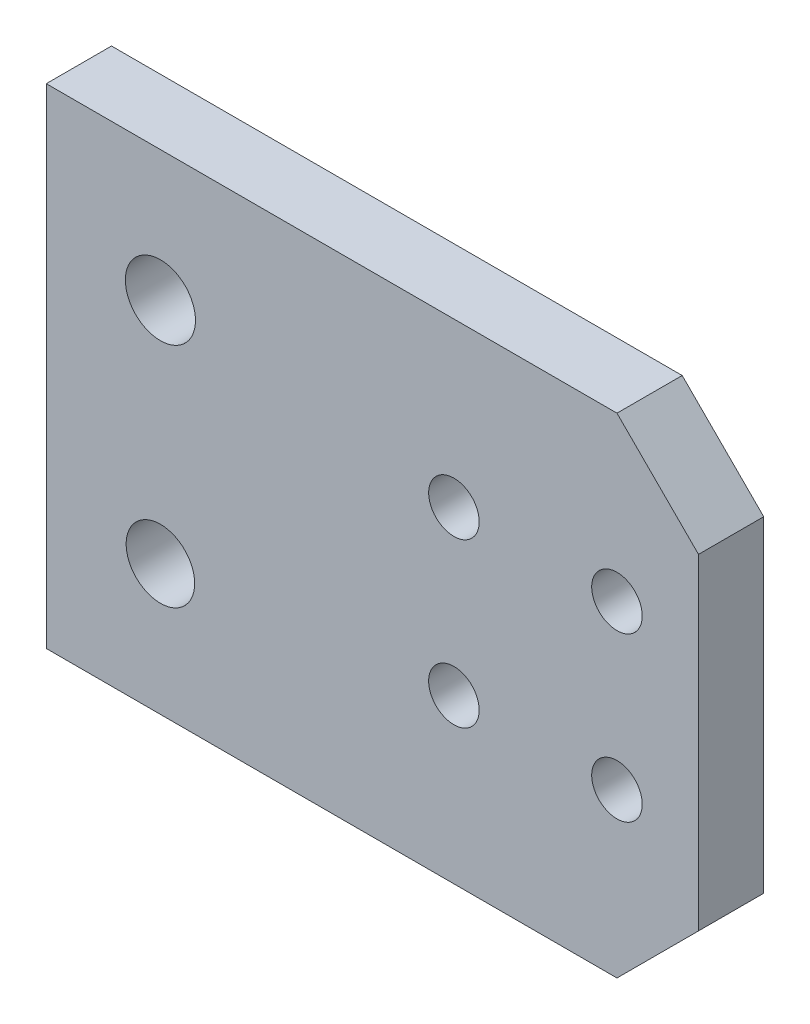
ISO-10303-21;
HEADER;
FILE_DESCRIPTION(('STEP AP214'),'2;1');
FILE_NAME('part.step','',(''),(''),'','','');
FILE_SCHEMA(('AUTOMOTIVE_DESIGN { 1 0 10303 214 1 1 1 1 }'));
ENDSEC;
DATA;
#1=APPLICATION_CONTEXT('core data for automotive mechanical design processes');
#2=APPLICATION_PROTOCOL_DEFINITION('international standard','automotive_design',2000,#1);
#3=PRODUCT_CONTEXT('',#1,'mechanical');
#4=PRODUCT('Part','Part','',(#3));
#5=PRODUCT_RELATED_PRODUCT_CATEGORY('part','',(#4));
#6=PRODUCT_DEFINITION_FORMATION('','',#4);
#7=PRODUCT_DEFINITION_CONTEXT('part definition',#1,'design');
#8=PRODUCT_DEFINITION('design','',#6,#7);
#9=PRODUCT_DEFINITION_SHAPE('','',#8);
#10=(LENGTH_UNIT() NAMED_UNIT(*) SI_UNIT(.MILLI.,.METRE.));
#11=(NAMED_UNIT(*) PLANE_ANGLE_UNIT() SI_UNIT($,.RADIAN.));
#12=(NAMED_UNIT(*) SI_UNIT($,.STERADIAN.) SOLID_ANGLE_UNIT());
#13=UNCERTAINTY_MEASURE_WITH_UNIT(LENGTH_MEASURE(1.E-05),#10,'distance_accuracy_value','');
#14=(GEOMETRIC_REPRESENTATION_CONTEXT(3) GLOBAL_UNCERTAINTY_ASSIGNED_CONTEXT((#13)) GLOBAL_UNIT_ASSIGNED_CONTEXT((#10,
#11,#12)) REPRESENTATION_CONTEXT('',''));
#15=CARTESIAN_POINT('',(0.,0.,0.));
#16=DIRECTION('',(0.,0.,1.));
#17=DIRECTION('',(1.,0.,0.));
#18=AXIS2_PLACEMENT_3D('',#15,#16,#17);
#19=CARTESIAN_POINT('',(0.,0.,4.));
#20=DIRECTION('',(0.,0.,-1.));
#21=DIRECTION('',(-1.,0.,0.));
#22=AXIS2_PLACEMENT_3D('',#19,#20,#21);
#23=PLANE('',#22);
#24=DIRECTION('',(1.,0.,0.));
#25=VECTOR('',#24,1.);
#26=CARTESIAN_POINT('',(0.,0.,4.));
#27=LINE('',#26,#25);
#28=CARTESIAN_POINT('',(0.,0.,4.));
#29=VERTEX_POINT('',#28);
#30=CARTESIAN_POINT('',(35.,0.,4.));
#31=VERTEX_POINT('',#30);
#32=EDGE_CURVE('E97',#29,#31,#27,.T.);
#33=ORIENTED_EDGE('',*,*,#32,.T.);
#34=DIRECTION('',(-0.707106781186549,-0.707106781186547,0.));
#35=VECTOR('',#34,1.);
#36=CARTESIAN_POINT('',(40.,5.,4.));
#37=LINE('',#36,#35);
#38=CARTESIAN_POINT('',(40.,5.,4.));
#39=VERTEX_POINT('',#38);
#40=EDGE_CURVE('E52',#31,#39,#37,.F.);
#41=ORIENTED_EDGE('',*,*,#40,.T.);
#42=DIRECTION('',(0.,1.,0.));
#43=VECTOR('',#42,1.);
#44=CARTESIAN_POINT('',(40.,0.,4.));
#45=LINE('',#44,#43);
#46=CARTESIAN_POINT('',(40.,25.,4.));
#47=VERTEX_POINT('',#46);
#48=EDGE_CURVE('E104',#39,#47,#45,.T.);
#49=ORIENTED_EDGE('',*,*,#48,.T.);
#50=DIRECTION('',(0.707106781186546,-0.70710678118655,0.));
#51=VECTOR('',#50,1.);
#52=CARTESIAN_POINT('',(35.,30.,4.));
#53=LINE('',#52,#51);
#54=CARTESIAN_POINT('',(35.,30.,4.));
#55=VERTEX_POINT('',#54);
#56=EDGE_CURVE('E59',#47,#55,#53,.F.);
#57=ORIENTED_EDGE('',*,*,#56,.T.);
#58=DIRECTION('',(-1.,0.,0.));
#59=VECTOR('',#58,1.);
#60=CARTESIAN_POINT('',(0.,30.,4.));
#61=LINE('',#60,#59);
#62=CARTESIAN_POINT('',(0.,30.,4.));
#63=VERTEX_POINT('',#62);
#64=EDGE_CURVE('E109',#55,#63,#61,.T.);
#65=ORIENTED_EDGE('',*,*,#64,.T.);
#66=DIRECTION('',(0.,-1.,0.));
#67=VECTOR('',#66,1.);
#68=CARTESIAN_POINT('',(0.,0.,4.));
#69=LINE('',#68,#67);
#70=EDGE_CURVE('E105',#63,#29,#69,.T.);
#71=ORIENTED_EDGE('',*,*,#70,.T.);
#72=EDGE_LOOP('',(#33,#41,#49,#57,#65,#71));
#73=FACE_BOUND('',#72,.T.);
#74=CARTESIAN_POINT('',(7.,22.,4.));
#75=DIRECTION('',(0.,0.,1.));
#76=DIRECTION('',(1.,0.,0.));
#77=AXIS2_PLACEMENT_3D('',#74,#75,#76);
#78=CIRCLE('',#77,2.14999999999999);
#79=CARTESIAN_POINT('',(9.14999999999999,22.,4.));
#80=VERTEX_POINT('',#79);
#81=EDGE_CURVE('E150',#80,#80,#78,.T.);
#82=ORIENTED_EDGE('',*,*,#81,.F.);
#83=EDGE_LOOP('',(#82));
#84=FACE_BOUND('',#83,.T.);
#85=CARTESIAN_POINT('',(7.,8.00000000000005,4.));
#86=DIRECTION('',(0.,0.,1.));
#87=DIRECTION('',(1.,0.,0.));
#88=AXIS2_PLACEMENT_3D('',#85,#86,#87);
#89=CIRCLE('',#88,2.09999999999999);
#90=CARTESIAN_POINT('',(9.09999999999999,8.00000000000005,4.));
#91=VERTEX_POINT('',#90);
#92=EDGE_CURVE('E316',#91,#91,#89,.T.);
#93=ORIENTED_EDGE('',*,*,#92,.F.);
#94=EDGE_LOOP('',(#93));
#95=FACE_BOUND('',#94,.T.);
#96=CARTESIAN_POINT('',(35.,20.,4.));
#97=DIRECTION('',(0.,0.,1.));
#98=DIRECTION('',(1.,0.,0.));
#99=AXIS2_PLACEMENT_3D('',#96,#97,#98);
#100=CIRCLE('',#99,1.54999999999999);
#101=CARTESIAN_POINT('',(36.55,20.,4.));
#102=VERTEX_POINT('',#101);
#103=EDGE_CURVE('E310',#102,#102,#100,.T.);
#104=ORIENTED_EDGE('',*,*,#103,.F.);
#105=EDGE_LOOP('',(#104));
#106=FACE_BOUND('',#105,.T.);
#107=CARTESIAN_POINT('',(25.,19.9999999999999,4.));
#108=DIRECTION('',(0.,0.,1.));
#109=DIRECTION('',(1.,0.,0.));
#110=AXIS2_PLACEMENT_3D('',#107,#108,#109);
#111=CIRCLE('',#110,1.54999999999999);
#112=CARTESIAN_POINT('',(26.55,19.9999999999999,4.));
#113=VERTEX_POINT('',#112);
#114=EDGE_CURVE('E304',#113,#113,#111,.T.);
#115=ORIENTED_EDGE('',*,*,#114,.F.);
#116=EDGE_LOOP('',(#115));
#117=FACE_BOUND('',#116,.T.);
#118=CARTESIAN_POINT('',(25.0000000000001,9.99999999999993,4.));
#119=DIRECTION('',(0.,0.,1.));
#120=DIRECTION('',(1.,0.,0.));
#121=AXIS2_PLACEMENT_3D('',#118,#119,#120);
#122=CIRCLE('',#121,1.54999999999999);
#123=CARTESIAN_POINT('',(26.5500000000001,9.99999999999993,4.));
#124=VERTEX_POINT('',#123);
#125=EDGE_CURVE('E298',#124,#124,#122,.T.);
#126=ORIENTED_EDGE('',*,*,#125,.F.);
#127=EDGE_LOOP('',(#126));
#128=FACE_BOUND('',#127,.T.);
#129=CARTESIAN_POINT('',(35.0000000000001,10.,4.));
#130=DIRECTION('',(0.,0.,1.));
#131=DIRECTION('',(1.,0.,0.));
#132=AXIS2_PLACEMENT_3D('',#129,#130,#131);
#133=CIRCLE('',#132,1.54999999999999);
#134=CARTESIAN_POINT('',(36.5500000000001,10.,4.));
#135=VERTEX_POINT('',#134);
#136=EDGE_CURVE('E289',#135,#135,#133,.T.);
#137=ORIENTED_EDGE('',*,*,#136,.F.);
#138=EDGE_LOOP('',(#137));
#139=FACE_BOUND('',#138,.T.);
#140=ADVANCED_FACE('F43',(#73,#84,#95,#106,#117,#128,#139),#23,.F.);
#141=CARTESIAN_POINT('',(0.,0.,0.));
#142=DIRECTION('',(0.,0.,-1.));
#143=DIRECTION('',(-1.,0.,0.));
#144=AXIS2_PLACEMENT_3D('',#141,#142,#143);
#145=PLANE('',#144);
#146=CARTESIAN_POINT('',(25.0000000000001,9.99999999999993,0.));
#147=DIRECTION('',(0.,0.,1.));
#148=DIRECTION('',(1.,0.,0.));
#149=AXIS2_PLACEMENT_3D('',#146,#147,#148);
#150=CIRCLE('',#149,1.54999999999999);
#151=CARTESIAN_POINT('',(26.5500000000001,9.99999999999993,0.));
#152=VERTEX_POINT('',#151);
#153=EDGE_CURVE('E295',#152,#152,#150,.T.);
#154=ORIENTED_EDGE('',*,*,#153,.T.);
#155=EDGE_LOOP('',(#154));
#156=FACE_BOUND('',#155,.T.);
#157=CARTESIAN_POINT('',(35.,20.,0.));
#158=DIRECTION('',(0.,0.,1.));
#159=DIRECTION('',(1.,0.,0.));
#160=AXIS2_PLACEMENT_3D('',#157,#158,#159);
#161=CIRCLE('',#160,1.54999999999999);
#162=CARTESIAN_POINT('',(36.55,20.,0.));
#163=VERTEX_POINT('',#162);
#164=EDGE_CURVE('E307',#163,#163,#161,.T.);
#165=ORIENTED_EDGE('',*,*,#164,.T.);
#166=EDGE_LOOP('',(#165));
#167=FACE_BOUND('',#166,.T.);
#168=CARTESIAN_POINT('',(7.,22.,0.));
#169=DIRECTION('',(0.,0.,1.));
#170=DIRECTION('',(1.,0.,0.));
#171=AXIS2_PLACEMENT_3D('',#168,#169,#170);
#172=CIRCLE('',#171,2.14999999999999);
#173=CARTESIAN_POINT('',(9.14999999999999,22.,0.));
#174=VERTEX_POINT('',#173);
#175=EDGE_CURVE('E319',#174,#174,#172,.T.);
#176=ORIENTED_EDGE('',*,*,#175,.T.);
#177=EDGE_LOOP('',(#176));
#178=FACE_BOUND('',#177,.T.);
#179=DIRECTION('',(0.,1.,0.));
#180=VECTOR('',#179,1.);
#181=CARTESIAN_POINT('',(40.,0.,0.));
#182=LINE('',#181,#180);
#183=CARTESIAN_POINT('',(40.,5.,0.));
#184=VERTEX_POINT('',#183);
#185=CARTESIAN_POINT('',(40.,25.,0.));
#186=VERTEX_POINT('',#185);
#187=EDGE_CURVE('E147',#184,#186,#182,.T.);
#188=ORIENTED_EDGE('',*,*,#187,.F.);
#189=DIRECTION('',(0.707106781186549,0.707106781186547,0.));
#190=VECTOR('',#189,1.);
#191=CARTESIAN_POINT('',(17.4999999999999,-17.5,0.));
#192=LINE('',#191,#190);
#193=CARTESIAN_POINT('',(35.,0.,0.));
#194=VERTEX_POINT('',#193);
#195=EDGE_CURVE('E130',#184,#194,#192,.F.);
#196=ORIENTED_EDGE('',*,*,#195,.T.);
#197=DIRECTION('',(1.,0.,0.));
#198=VECTOR('',#197,1.);
#199=CARTESIAN_POINT('',(0.,0.,0.));
#200=LINE('',#199,#198);
#201=CARTESIAN_POINT('',(0.,0.,0.));
#202=VERTEX_POINT('',#201);
#203=EDGE_CURVE('E146',#202,#194,#200,.T.);
#204=ORIENTED_EDGE('',*,*,#203,.F.);
#205=DIRECTION('',(0.,-1.,0.));
#206=VECTOR('',#205,1.);
#207=CARTESIAN_POINT('',(0.,0.,0.));
#208=LINE('',#207,#206);
#209=CARTESIAN_POINT('',(0.,30.,0.));
#210=VERTEX_POINT('',#209);
#211=EDGE_CURVE('E117',#210,#202,#208,.T.);
#212=ORIENTED_EDGE('',*,*,#211,.F.);
#213=DIRECTION('',(-1.,0.,0.));
#214=VECTOR('',#213,1.);
#215=CARTESIAN_POINT('',(0.,30.,0.));
#216=LINE('',#215,#214);
#217=CARTESIAN_POINT('',(35.,30.,0.));
#218=VERTEX_POINT('',#217);
#219=EDGE_CURVE('E113',#218,#210,#216,.T.);
#220=ORIENTED_EDGE('',*,*,#219,.F.);
#221=DIRECTION('',(-0.707106781186546,0.70710678118655,0.));
#222=VECTOR('',#221,1.);
#223=CARTESIAN_POINT('',(32.5000000000001,32.4999999999999,0.));
#224=LINE('',#223,#222);
#225=EDGE_CURVE('E128',#218,#186,#224,.F.);
#226=ORIENTED_EDGE('',*,*,#225,.T.);
#227=EDGE_LOOP('',(#188,#196,#204,#212,#220,#226));
#228=FACE_BOUND('',#227,.T.);
#229=CARTESIAN_POINT('',(7.,8.00000000000005,0.));
#230=DIRECTION('',(0.,0.,1.));
#231=DIRECTION('',(1.,0.,0.));
#232=AXIS2_PLACEMENT_3D('',#229,#230,#231);
#233=CIRCLE('',#232,2.09999999999999);
#234=CARTESIAN_POINT('',(9.09999999999999,8.00000000000005,0.));
#235=VERTEX_POINT('',#234);
#236=EDGE_CURVE('E313',#235,#235,#233,.T.);
#237=ORIENTED_EDGE('',*,*,#236,.T.);
#238=EDGE_LOOP('',(#237));
#239=FACE_BOUND('',#238,.T.);
#240=CARTESIAN_POINT('',(25.,19.9999999999999,0.));
#241=DIRECTION('',(0.,0.,1.));
#242=DIRECTION('',(1.,0.,0.));
#243=AXIS2_PLACEMENT_3D('',#240,#241,#242);
#244=CIRCLE('',#243,1.54999999999999);
#245=CARTESIAN_POINT('',(26.55,19.9999999999999,0.));
#246=VERTEX_POINT('',#245);
#247=EDGE_CURVE('E301',#246,#246,#244,.T.);
#248=ORIENTED_EDGE('',*,*,#247,.T.);
#249=EDGE_LOOP('',(#248));
#250=FACE_BOUND('',#249,.T.);
#251=CARTESIAN_POINT('',(35.0000000000001,10.,0.));
#252=DIRECTION('',(0.,0.,1.));
#253=DIRECTION('',(1.,0.,0.));
#254=AXIS2_PLACEMENT_3D('',#251,#252,#253);
#255=CIRCLE('',#254,1.54999999999999);
#256=CARTESIAN_POINT('',(36.5500000000001,10.,0.));
#257=VERTEX_POINT('',#256);
#258=EDGE_CURVE('E292',#257,#257,#255,.T.);
#259=ORIENTED_EDGE('',*,*,#258,.T.);
#260=EDGE_LOOP('',(#259));
#261=FACE_BOUND('',#260,.T.);
#262=ADVANCED_FACE('F144',(#156,#167,#178,#228,#239,#250,#261),#145,.T.);
#263=CARTESIAN_POINT('',(0.,0.,4.));
#264=DIRECTION('',(1.,0.,0.));
#265=DIRECTION('',(0.,0.,-1.));
#266=AXIS2_PLACEMENT_3D('',#263,#264,#265);
#267=PLANE('',#266);
#268=ORIENTED_EDGE('',*,*,#211,.T.);
#269=DIRECTION('',(0.,0.,-1.));
#270=VECTOR('',#269,1.);
#271=CARTESIAN_POINT('',(0.,0.,4.));
#272=LINE('',#271,#270);
#273=EDGE_CURVE('E101',#29,#202,#272,.T.);
#274=ORIENTED_EDGE('',*,*,#273,.F.);
#275=ORIENTED_EDGE('',*,*,#70,.F.);
#276=DIRECTION('',(0.,0.,-1.));
#277=VECTOR('',#276,1.);
#278=CARTESIAN_POINT('',(0.,30.,4.));
#279=LINE('',#278,#277);
#280=EDGE_CURVE('E119',#63,#210,#279,.T.);
#281=ORIENTED_EDGE('',*,*,#280,.T.);
#282=EDGE_LOOP('',(#268,#274,#275,#281));
#283=FACE_BOUND('',#282,.T.);
#284=ADVANCED_FACE('F115',(#283),#267,.F.);
#285=CARTESIAN_POINT('',(0.,0.,4.));
#286=DIRECTION('',(0.,1.,0.));
#287=DIRECTION('',(0.,0.,1.));
#288=AXIS2_PLACEMENT_3D('',#285,#286,#287);
#289=PLANE('',#288);
#290=ORIENTED_EDGE('',*,*,#203,.T.);
#291=DIRECTION('',(0.,0.,1.));
#292=VECTOR('',#291,1.);
#293=CARTESIAN_POINT('',(35.,0.,4.));
#294=LINE('',#293,#292);
#295=EDGE_CURVE('E67',#194,#31,#294,.T.);
#296=ORIENTED_EDGE('',*,*,#295,.T.);
#297=ORIENTED_EDGE('',*,*,#32,.F.);
#298=ORIENTED_EDGE('',*,*,#273,.T.);
#299=EDGE_LOOP('',(#290,#296,#297,#298));
#300=FACE_BOUND('',#299,.T.);
#301=ADVANCED_FACE('F99',(#300),#289,.F.);
#302=CARTESIAN_POINT('',(40.,0.,4.));
#303=DIRECTION('',(-1.,0.,0.));
#304=DIRECTION('',(0.,0.,1.));
#305=AXIS2_PLACEMENT_3D('',#302,#303,#304);
#306=PLANE('',#305);
#307=ORIENTED_EDGE('',*,*,#48,.F.);
#308=DIRECTION('',(0.,0.,-1.));
#309=VECTOR('',#308,1.);
#310=CARTESIAN_POINT('',(40.,5.,4.));
#311=LINE('',#310,#309);
#312=EDGE_CURVE('E121',#39,#184,#311,.T.);
#313=ORIENTED_EDGE('',*,*,#312,.T.);
#314=ORIENTED_EDGE('',*,*,#187,.T.);
#315=DIRECTION('',(0.,0.,1.));
#316=VECTOR('',#315,1.);
#317=CARTESIAN_POINT('',(40.,25.,4.));
#318=LINE('',#317,#316);
#319=EDGE_CURVE('E118',#186,#47,#318,.T.);
#320=ORIENTED_EDGE('',*,*,#319,.T.);
#321=EDGE_LOOP('',(#307,#313,#314,#320));
#322=FACE_BOUND('',#321,.T.);
#323=ADVANCED_FACE('F137',(#322),#306,.F.);
#324=CARTESIAN_POINT('',(0.,30.,4.));
#325=DIRECTION('',(0.,-1.,0.));
#326=DIRECTION('',(0.,0.,-1.));
#327=AXIS2_PLACEMENT_3D('',#324,#325,#326);
#328=PLANE('',#327);
#329=ORIENTED_EDGE('',*,*,#64,.F.);
#330=DIRECTION('',(0.,0.,-1.));
#331=VECTOR('',#330,1.);
#332=CARTESIAN_POINT('',(35.,30.,4.));
#333=LINE('',#332,#331);
#334=EDGE_CURVE('E11',#55,#218,#333,.T.);
#335=ORIENTED_EDGE('',*,*,#334,.T.);
#336=ORIENTED_EDGE('',*,*,#219,.T.);
#337=ORIENTED_EDGE('',*,*,#280,.F.);
#338=EDGE_LOOP('',(#329,#335,#336,#337));
#339=FACE_BOUND('',#338,.T.);
#340=ADVANCED_FACE('F155',(#339),#328,.F.);
#341=CARTESIAN_POINT('',(7.,22.,4.));
#342=DIRECTION('',(0.,0.,-1.));
#343=DIRECTION('',(-1.,0.,0.));
#344=AXIS2_PLACEMENT_3D('',#341,#342,#343);
#345=CYLINDRICAL_SURFACE('',#344,2.14999999999999);
#346=ORIENTED_EDGE('',*,*,#81,.T.);
#347=EDGE_LOOP('',(#346));
#348=FACE_BOUND('',#347,.T.);
#349=ORIENTED_EDGE('',*,*,#175,.F.);
#350=EDGE_LOOP('',(#349));
#351=FACE_BOUND('',#350,.T.);
#352=ADVANCED_FACE('F172',(#348,#351),#345,.F.);
#353=CARTESIAN_POINT('',(7.,8.00000000000005,4.));
#354=DIRECTION('',(0.,0.,-1.));
#355=DIRECTION('',(-1.,0.,0.));
#356=AXIS2_PLACEMENT_3D('',#353,#354,#355);
#357=CYLINDRICAL_SURFACE('',#356,2.09999999999999);
#358=ORIENTED_EDGE('',*,*,#92,.T.);
#359=EDGE_LOOP('',(#358));
#360=FACE_BOUND('',#359,.T.);
#361=ORIENTED_EDGE('',*,*,#236,.F.);
#362=EDGE_LOOP('',(#361));
#363=FACE_BOUND('',#362,.T.);
#364=ADVANCED_FACE('F198',(#360,#363),#357,.F.);
#365=CARTESIAN_POINT('',(35.,20.,4.));
#366=DIRECTION('',(0.,0.,-1.));
#367=DIRECTION('',(-1.,0.,0.));
#368=AXIS2_PLACEMENT_3D('',#365,#366,#367);
#369=CYLINDRICAL_SURFACE('',#368,1.54999999999999);
#370=ORIENTED_EDGE('',*,*,#103,.T.);
#371=EDGE_LOOP('',(#370));
#372=FACE_BOUND('',#371,.T.);
#373=ORIENTED_EDGE('',*,*,#164,.F.);
#374=EDGE_LOOP('',(#373));
#375=FACE_BOUND('',#374,.T.);
#376=ADVANCED_FACE('F207',(#372,#375),#369,.F.);
#377=CARTESIAN_POINT('',(25.,19.9999999999999,4.));
#378=DIRECTION('',(0.,0.,-1.));
#379=DIRECTION('',(-1.,0.,0.));
#380=AXIS2_PLACEMENT_3D('',#377,#378,#379);
#381=CYLINDRICAL_SURFACE('',#380,1.54999999999999);
#382=ORIENTED_EDGE('',*,*,#114,.T.);
#383=EDGE_LOOP('',(#382));
#384=FACE_BOUND('',#383,.T.);
#385=ORIENTED_EDGE('',*,*,#247,.F.);
#386=EDGE_LOOP('',(#385));
#387=FACE_BOUND('',#386,.T.);
#388=ADVANCED_FACE('F215',(#384,#387),#381,.F.);
#389=CARTESIAN_POINT('',(25.0000000000001,9.99999999999993,4.));
#390=DIRECTION('',(0.,0.,-1.));
#391=DIRECTION('',(-1.,0.,0.));
#392=AXIS2_PLACEMENT_3D('',#389,#390,#391);
#393=CYLINDRICAL_SURFACE('',#392,1.54999999999999);
#394=ORIENTED_EDGE('',*,*,#125,.T.);
#395=EDGE_LOOP('',(#394));
#396=FACE_BOUND('',#395,.T.);
#397=ORIENTED_EDGE('',*,*,#153,.F.);
#398=EDGE_LOOP('',(#397));
#399=FACE_BOUND('',#398,.T.);
#400=ADVANCED_FACE('F224',(#396,#399),#393,.F.);
#401=CARTESIAN_POINT('',(35.0000000000001,10.,4.));
#402=DIRECTION('',(0.,0.,-1.));
#403=DIRECTION('',(-1.,0.,0.));
#404=AXIS2_PLACEMENT_3D('',#401,#402,#403);
#405=CYLINDRICAL_SURFACE('',#404,1.54999999999999);
#406=ORIENTED_EDGE('',*,*,#136,.T.);
#407=EDGE_LOOP('',(#406));
#408=FACE_BOUND('',#407,.T.);
#409=ORIENTED_EDGE('',*,*,#258,.F.);
#410=EDGE_LOOP('',(#409));
#411=FACE_BOUND('',#410,.T.);
#412=ADVANCED_FACE('F162',(#408,#411),#405,.F.);
#413=CARTESIAN_POINT('',(40.,5.,4.));
#414=DIRECTION('',(-0.707106781186547,0.707106781186549,0.));
#415=DIRECTION('',(0.,0.,-1.));
#416=AXIS2_PLACEMENT_3D('',#413,#414,#415);
#417=PLANE('',#416);
#418=ORIENTED_EDGE('',*,*,#40,.F.);
#419=ORIENTED_EDGE('',*,*,#295,.F.);
#420=ORIENTED_EDGE('',*,*,#195,.F.);
#421=ORIENTED_EDGE('',*,*,#312,.F.);
#422=EDGE_LOOP('',(#418,#419,#420,#421));
#423=FACE_BOUND('',#422,.T.);
#424=ADVANCED_FACE('F142',(#423),#417,.F.);
#425=CARTESIAN_POINT('',(35.,30.,4.));
#426=DIRECTION('',(-0.70710678118655,-0.707106781186546,0.));
#427=DIRECTION('',(0.,0.,-1.));
#428=AXIS2_PLACEMENT_3D('',#425,#426,#427);
#429=PLANE('',#428);
#430=ORIENTED_EDGE('',*,*,#56,.F.);
#431=ORIENTED_EDGE('',*,*,#319,.F.);
#432=ORIENTED_EDGE('',*,*,#225,.F.);
#433=ORIENTED_EDGE('',*,*,#334,.F.);
#434=EDGE_LOOP('',(#430,#431,#432,#433));
#435=FACE_BOUND('',#434,.T.);
#436=ADVANCED_FACE('F46',(#435),#429,.F.);
#437=CLOSED_SHELL('',(#140,#262,#284,#301,#323,#340,#352,#364,#376,#388,#400,#412,#424,#436));
#438=MANIFOLD_SOLID_BREP('B2',#437);
#439=ADVANCED_BREP_SHAPE_REPRESENTATION('',(#18,#438),#14);
#440=SHAPE_DEFINITION_REPRESENTATION(#9,#439);
ENDSEC;
END-ISO-10303-21;
